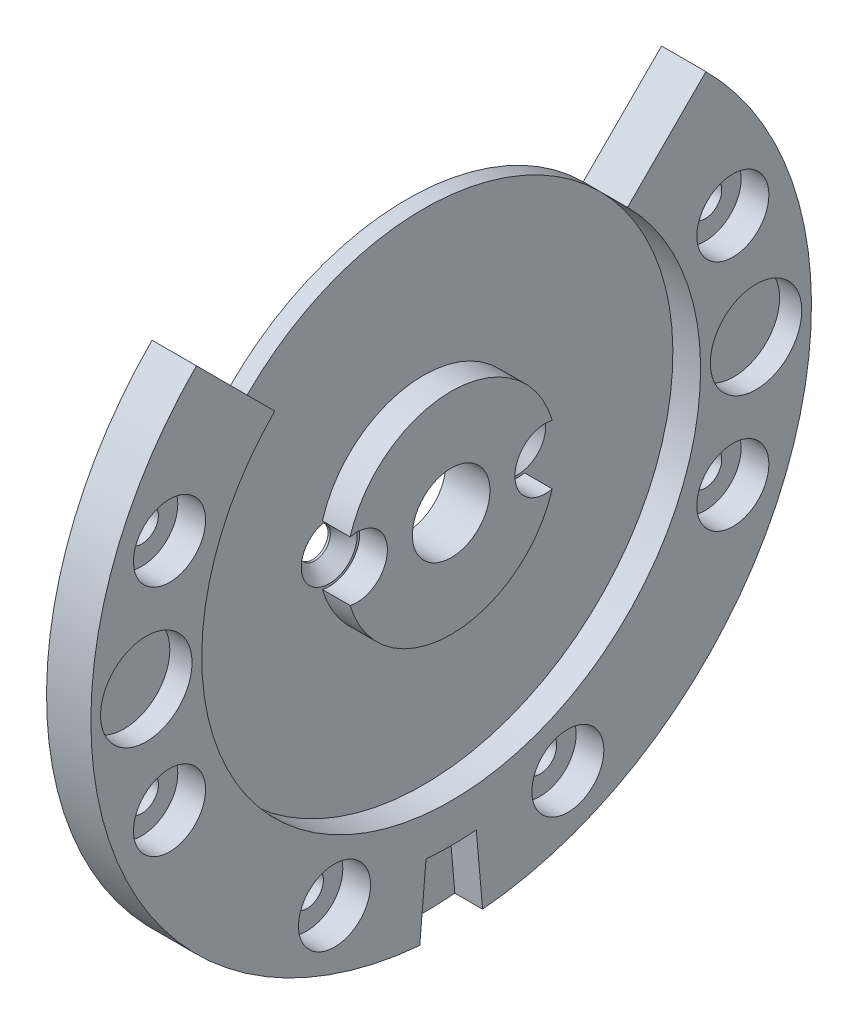
ISO-10303-21;
HEADER;
FILE_DESCRIPTION(('STEP AP214'),'2;1');
FILE_NAME('part.step','',(''),(''),'','','');
FILE_SCHEMA(('AUTOMOTIVE_DESIGN { 1 0 10303 214 1 1 1 1 }'));
ENDSEC;
DATA;
#1=APPLICATION_CONTEXT('core data for automotive mechanical design processes');
#2=APPLICATION_PROTOCOL_DEFINITION('international standard','automotive_design',2000,#1);
#3=PRODUCT_CONTEXT('',#1,'mechanical');
#4=PRODUCT('Part','Part','',(#3));
#5=PRODUCT_RELATED_PRODUCT_CATEGORY('part','',(#4));
#6=PRODUCT_DEFINITION_FORMATION('','',#4);
#7=PRODUCT_DEFINITION_CONTEXT('part definition',#1,'design');
#8=PRODUCT_DEFINITION('design','',#6,#7);
#9=PRODUCT_DEFINITION_SHAPE('','',#8);
#10=(LENGTH_UNIT() NAMED_UNIT(*) SI_UNIT(.MILLI.,.METRE.));
#11=(NAMED_UNIT(*) PLANE_ANGLE_UNIT() SI_UNIT($,.RADIAN.));
#12=(NAMED_UNIT(*) SI_UNIT($,.STERADIAN.) SOLID_ANGLE_UNIT());
#13=UNCERTAINTY_MEASURE_WITH_UNIT(LENGTH_MEASURE(1.E-05),#10,'distance_accuracy_value','');
#14=(GEOMETRIC_REPRESENTATION_CONTEXT(3) GLOBAL_UNCERTAINTY_ASSIGNED_CONTEXT((#13)) GLOBAL_UNIT_ASSIGNED_CONTEXT((#10,
#11,#12)) REPRESENTATION_CONTEXT('',''));
#15=CARTESIAN_POINT('',(0.,0.,0.));
#16=DIRECTION('',(0.,0.,1.));
#17=DIRECTION('',(1.,0.,0.));
#18=AXIS2_PLACEMENT_3D('',#15,#16,#17);
#19=CARTESIAN_POINT('',(0.,0.,0.));
#20=DIRECTION('',(-1.,0.,0.));
#21=DIRECTION('',(0.,0.,1.));
#22=AXIS2_PLACEMENT_3D('',#19,#20,#21);
#23=CYLINDRICAL_SURFACE('',#22,9.5);
#24=CARTESIAN_POINT('',(1.5,0.,0.));
#25=DIRECTION('',(-1.,0.,0.));
#26=DIRECTION('',(0.,0.,1.));
#27=AXIS2_PLACEMENT_3D('',#24,#25,#26);
#28=CIRCLE('',#27,9.5);
#29=CARTESIAN_POINT('',(1.5,2.68058577866524,9.11397058823527));
#30=VERTEX_POINT('',#29);
#31=CARTESIAN_POINT('',(1.5,2.68058577866518,-9.11397058823529));
#32=VERTEX_POINT('',#31);
#33=EDGE_CURVE('E139',#30,#32,#28,.T.);
#34=ORIENTED_EDGE('',*,*,#33,.F.);
#35=DIRECTION('',(1.,0.,0.));
#36=VECTOR('',#35,1.);
#37=CARTESIAN_POINT('',(2.75,2.68058577866524,9.11397058823527));
#38=LINE('',#37,#36);
#39=CARTESIAN_POINT('',(4.,2.68058577866524,9.11397058823527));
#40=VERTEX_POINT('',#39);
#41=EDGE_CURVE('E128',#30,#40,#38,.T.);
#42=ORIENTED_EDGE('',*,*,#41,.T.);
#43=CARTESIAN_POINT('',(4.,0.,0.));
#44=DIRECTION('',(-1.,0.,0.));
#45=DIRECTION('',(0.,0.,1.));
#46=AXIS2_PLACEMENT_3D('',#43,#44,#45);
#47=CIRCLE('',#46,9.5);
#48=CARTESIAN_POINT('',(4.,2.68058577866518,-9.11397058823529));
#49=VERTEX_POINT('',#48);
#50=EDGE_CURVE('E57',#40,#49,#47,.T.);
#51=ORIENTED_EDGE('',*,*,#50,.T.);
#52=DIRECTION('',(1.,0.,0.));
#53=VECTOR('',#52,1.);
#54=CARTESIAN_POINT('',(2.75,2.68058577866518,-9.11397058823529));
#55=LINE('',#54,#53);
#56=EDGE_CURVE('E145',#49,#32,#55,.F.);
#57=ORIENTED_EDGE('',*,*,#56,.T.);
#58=EDGE_LOOP('',(#34,#42,#51,#57));
#59=FACE_BOUND('',#58,.T.);
#60=ADVANCED_FACE('F35',(#59),#23,.T.);
#61=CARTESIAN_POINT('',(0.,10.5237943900396,-25.4066871440605));
#62=DIRECTION('',(1.,0.,0.));
#63=DIRECTION('',(0.,0.,-1.));
#64=AXIS2_PLACEMENT_3D('',#61,#62,#63);
#65=CYLINDRICAL_SURFACE('',#64,1.5);
#66=CARTESIAN_POINT('',(0.,10.5237943900396,-25.4066871440605));
#67=DIRECTION('',(1.,0.,0.));
#68=DIRECTION('',(0.,0.,-1.));
#69=AXIS2_PLACEMENT_3D('',#66,#67,#68);
#70=CIRCLE('',#69,1.5);
#71=CARTESIAN_POINT('',(0.,10.5237943900396,-26.9066871440605));
#72=VERTEX_POINT('',#71);
#73=EDGE_CURVE('E296',#72,#72,#70,.T.);
#74=ORIENTED_EDGE('',*,*,#73,.F.);
#75=EDGE_LOOP('',(#74));
#76=FACE_BOUND('',#75,.T.);
#77=CARTESIAN_POINT('',(1.5,10.5237943900396,-25.4066871440605));
#78=DIRECTION('',(1.,0.,0.));
#79=DIRECTION('',(0.,0.,-1.));
#80=AXIS2_PLACEMENT_3D('',#77,#78,#79);
#81=CIRCLE('',#80,1.5);
#82=CARTESIAN_POINT('',(1.5,10.5237943900396,-26.9066871440605));
#83=VERTEX_POINT('',#82);
#84=EDGE_CURVE('E188',#83,#83,#81,.F.);
#85=ORIENTED_EDGE('',*,*,#84,.F.);
#86=EDGE_LOOP('',(#85));
#87=FACE_BOUND('',#86,.T.);
#88=ADVANCED_FACE('F344',(#76,#87),#65,.F.);
#89=CARTESIAN_POINT('',(0.,-10.52379439004,-25.4066871440604));
#90=DIRECTION('',(1.,0.,0.));
#91=DIRECTION('',(0.,0.,-1.));
#92=AXIS2_PLACEMENT_3D('',#89,#90,#91);
#93=CYLINDRICAL_SURFACE('',#92,1.5);
#94=CARTESIAN_POINT('',(0.,-10.52379439004,-25.4066871440604));
#95=DIRECTION('',(1.,0.,0.));
#96=DIRECTION('',(0.,0.,-1.));
#97=AXIS2_PLACEMENT_3D('',#94,#95,#96);
#98=CIRCLE('',#97,1.5);
#99=CARTESIAN_POINT('',(0.,-10.52379439004,-26.9066871440604));
#100=VERTEX_POINT('',#99);
#101=EDGE_CURVE('E301',#100,#100,#98,.T.);
#102=ORIENTED_EDGE('',*,*,#101,.F.);
#103=EDGE_LOOP('',(#102));
#104=FACE_BOUND('',#103,.T.);
#105=CARTESIAN_POINT('',(1.5,-10.52379439004,-25.4066871440604));
#106=DIRECTION('',(1.,0.,0.));
#107=DIRECTION('',(0.,0.,-1.));
#108=AXIS2_PLACEMENT_3D('',#105,#106,#107);
#109=CIRCLE('',#108,1.5);
#110=CARTESIAN_POINT('',(1.5,-10.52379439004,-26.9066871440604));
#111=VERTEX_POINT('',#110);
#112=EDGE_CURVE('E184',#111,#111,#109,.F.);
#113=ORIENTED_EDGE('',*,*,#112,.F.);
#114=EDGE_LOOP('',(#113));
#115=FACE_BOUND('',#114,.T.);
#116=ADVANCED_FACE('F350',(#104,#115),#93,.F.);
#117=CARTESIAN_POINT('',(0.,-25.4066871440604,-10.5237943900399));
#118=DIRECTION('',(1.,0.,0.));
#119=DIRECTION('',(0.,0.,-1.));
#120=AXIS2_PLACEMENT_3D('',#117,#118,#119);
#121=CYLINDRICAL_SURFACE('',#120,1.5);
#122=CARTESIAN_POINT('',(0.,-25.4066871440604,-10.5237943900399));
#123=DIRECTION('',(1.,0.,0.));
#124=DIRECTION('',(0.,0.,-1.));
#125=AXIS2_PLACEMENT_3D('',#122,#123,#124);
#126=CIRCLE('',#125,1.5);
#127=CARTESIAN_POINT('',(0.,-25.4066871440604,-12.0237943900399));
#128=VERTEX_POINT('',#127);
#129=EDGE_CURVE('E304',#128,#128,#126,.T.);
#130=ORIENTED_EDGE('',*,*,#129,.F.);
#131=EDGE_LOOP('',(#130));
#132=FACE_BOUND('',#131,.T.);
#133=CARTESIAN_POINT('',(1.5,-25.4066871440604,-10.5237943900399));
#134=DIRECTION('',(1.,0.,0.));
#135=DIRECTION('',(0.,0.,-1.));
#136=AXIS2_PLACEMENT_3D('',#133,#134,#135);
#137=CIRCLE('',#136,1.5);
#138=CARTESIAN_POINT('',(1.5,-25.4066871440604,-12.0237943900399));
#139=VERTEX_POINT('',#138);
#140=EDGE_CURVE('E179',#139,#139,#137,.F.);
#141=ORIENTED_EDGE('',*,*,#140,.F.);
#142=EDGE_LOOP('',(#141));
#143=FACE_BOUND('',#142,.T.);
#144=ADVANCED_FACE('F442',(#132,#143),#121,.F.);
#145=CARTESIAN_POINT('',(0.,-25.4066871440603,10.5237943900401));
#146=DIRECTION('',(1.,0.,0.));
#147=DIRECTION('',(0.,0.,-1.));
#148=AXIS2_PLACEMENT_3D('',#145,#146,#147);
#149=CYLINDRICAL_SURFACE('',#148,1.50000000000001);
#150=CARTESIAN_POINT('',(0.,-25.4066871440603,10.5237943900401));
#151=DIRECTION('',(1.,0.,0.));
#152=DIRECTION('',(0.,0.,-1.));
#153=AXIS2_PLACEMENT_3D('',#150,#151,#152);
#154=CIRCLE('',#153,1.50000000000001);
#155=CARTESIAN_POINT('',(0.,-25.4066871440603,9.02379439004007));
#156=VERTEX_POINT('',#155);
#157=EDGE_CURVE('E307',#156,#156,#154,.T.);
#158=ORIENTED_EDGE('',*,*,#157,.F.);
#159=EDGE_LOOP('',(#158));
#160=FACE_BOUND('',#159,.T.);
#161=CARTESIAN_POINT('',(1.5,-25.4066871440603,10.5237943900401));
#162=DIRECTION('',(1.,0.,0.));
#163=DIRECTION('',(0.,0.,-1.));
#164=AXIS2_PLACEMENT_3D('',#161,#162,#163);
#165=CIRCLE('',#164,1.50000000000001);
#166=CARTESIAN_POINT('',(1.5,-25.4066871440603,9.02379439004007));
#167=VERTEX_POINT('',#166);
#168=EDGE_CURVE('E174',#167,#167,#165,.F.);
#169=ORIENTED_EDGE('',*,*,#168,.F.);
#170=EDGE_LOOP('',(#169));
#171=FACE_BOUND('',#170,.T.);
#172=ADVANCED_FACE('F446',(#160,#171),#149,.F.);
#173=CARTESIAN_POINT('',(0.,-10.5237943900398,25.4066871440604));
#174=DIRECTION('',(1.,0.,0.));
#175=DIRECTION('',(0.,0.,-1.));
#176=AXIS2_PLACEMENT_3D('',#173,#174,#175);
#177=CYLINDRICAL_SURFACE('',#176,1.5);
#178=CARTESIAN_POINT('',(0.,-10.5237943900398,25.4066871440604));
#179=DIRECTION('',(1.,0.,0.));
#180=DIRECTION('',(0.,0.,-1.));
#181=AXIS2_PLACEMENT_3D('',#178,#179,#180);
#182=CIRCLE('',#181,1.5);
#183=CARTESIAN_POINT('',(0.,-10.5237943900398,23.9066871440604));
#184=VERTEX_POINT('',#183);
#185=EDGE_CURVE('E310',#184,#184,#182,.T.);
#186=ORIENTED_EDGE('',*,*,#185,.F.);
#187=EDGE_LOOP('',(#186));
#188=FACE_BOUND('',#187,.T.);
#189=CARTESIAN_POINT('',(1.5,-10.5237943900398,25.4066871440604));
#190=DIRECTION('',(1.,0.,0.));
#191=DIRECTION('',(0.,0.,-1.));
#192=AXIS2_PLACEMENT_3D('',#189,#190,#191);
#193=CIRCLE('',#192,1.5);
#194=CARTESIAN_POINT('',(1.5,-10.5237943900398,23.9066871440604));
#195=VERTEX_POINT('',#194);
#196=EDGE_CURVE('E169',#195,#195,#193,.F.);
#197=ORIENTED_EDGE('',*,*,#196,.F.);
#198=EDGE_LOOP('',(#197));
#199=FACE_BOUND('',#198,.T.);
#200=ADVANCED_FACE('F322',(#188,#199),#177,.F.);
#201=CARTESIAN_POINT('',(0.,10.5237943900402,25.4066871440603));
#202=DIRECTION('',(1.,0.,0.));
#203=DIRECTION('',(0.,0.,-1.));
#204=AXIS2_PLACEMENT_3D('',#201,#202,#203);
#205=CYLINDRICAL_SURFACE('',#204,1.5);
#206=CARTESIAN_POINT('',(0.,10.5237943900402,25.4066871440603));
#207=DIRECTION('',(1.,0.,0.));
#208=DIRECTION('',(0.,0.,-1.));
#209=AXIS2_PLACEMENT_3D('',#206,#207,#208);
#210=CIRCLE('',#209,1.5);
#211=CARTESIAN_POINT('',(0.,10.5237943900402,23.9066871440603));
#212=VERTEX_POINT('',#211);
#213=EDGE_CURVE('E312',#212,#212,#210,.T.);
#214=ORIENTED_EDGE('',*,*,#213,.F.);
#215=EDGE_LOOP('',(#214));
#216=FACE_BOUND('',#215,.T.);
#217=CARTESIAN_POINT('',(1.5,10.5237943900402,25.4066871440603));
#218=DIRECTION('',(1.,0.,0.));
#219=DIRECTION('',(0.,0.,-1.));
#220=AXIS2_PLACEMENT_3D('',#217,#218,#219);
#221=CIRCLE('',#220,1.5);
#222=CARTESIAN_POINT('',(1.5,10.5237943900402,23.9066871440603));
#223=VERTEX_POINT('',#222);
#224=EDGE_CURVE('E164',#223,#223,#221,.F.);
#225=ORIENTED_EDGE('',*,*,#224,.F.);
#226=EDGE_LOOP('',(#225));
#227=FACE_BOUND('',#226,.T.);
#228=ADVANCED_FACE('F318',(#216,#227),#205,.F.);
#229=CARTESIAN_POINT('',(0.,0.,0.));
#230=DIRECTION('',(-1.,0.,0.));
#231=DIRECTION('',(0.,0.,1.));
#232=AXIS2_PLACEMENT_3D('',#229,#230,#231);
#233=CYLINDRICAL_SURFACE('',#232,32.5);
#234=DIRECTION('',(1.,0.,0.));
#235=VECTOR('',#234,1.);
#236=CARTESIAN_POINT('',(1.5,-32.3763276879817,-2.83256163929879));
#237=LINE('',#236,#235);
#238=CARTESIAN_POINT('',(1.5,-32.3763276879817,-2.83256163929879));
#239=VERTEX_POINT('',#238);
#240=CARTESIAN_POINT('',(4.,-32.3763276879817,-2.83256163929879));
#241=VERTEX_POINT('',#240);
#242=EDGE_CURVE('E260',#239,#241,#237,.T.);
#243=ORIENTED_EDGE('',*,*,#242,.F.);
#244=CARTESIAN_POINT('',(1.5,0.,0.));
#245=DIRECTION('',(1.,0.,0.));
#246=DIRECTION('',(0.,0.,-1.));
#247=AXIS2_PLACEMENT_3D('',#244,#245,#246);
#248=CIRCLE('',#247,32.5);
#249=CARTESIAN_POINT('',(1.5,-32.3763276879817,2.83256163929901));
#250=VERTEX_POINT('',#249);
#251=EDGE_CURVE('E244',#250,#239,#248,.T.);
#252=ORIENTED_EDGE('',*,*,#251,.F.);
#253=DIRECTION('',(1.,0.,0.));
#254=VECTOR('',#253,1.);
#255=CARTESIAN_POINT('',(1.5,-32.3763276879817,2.83256163929901));
#256=LINE('',#255,#254);
#257=CARTESIAN_POINT('',(4.,-32.3763276879817,2.83256163929901));
#258=VERTEX_POINT('',#257);
#259=EDGE_CURVE('E262',#250,#258,#256,.T.);
#260=ORIENTED_EDGE('',*,*,#259,.T.);
#261=CARTESIAN_POINT('',(4.,0.,0.));
#262=DIRECTION('',(-1.,0.,0.));
#263=DIRECTION('',(0.,0.,1.));
#264=AXIS2_PLACEMENT_3D('',#261,#262,#263);
#265=CIRCLE('',#264,32.5);
#266=CARTESIAN_POINT('',(4.,22.9809703885627,22.9809703885629));
#267=VERTEX_POINT('',#266);
#268=EDGE_CURVE('E158',#258,#267,#265,.T.);
#269=ORIENTED_EDGE('',*,*,#268,.T.);
#270=DIRECTION('',(1.,0.,0.));
#271=VECTOR('',#270,1.);
#272=CARTESIAN_POINT('',(-6.,22.9809703885627,22.9809703885629));
#273=LINE('',#272,#271);
#274=CARTESIAN_POINT('',(0.,22.9809703885627,22.9809703885629));
#275=VERTEX_POINT('',#274);
#276=EDGE_CURVE('E276',#275,#267,#273,.T.);
#277=ORIENTED_EDGE('',*,*,#276,.F.);
#278=CARTESIAN_POINT('',(0.,0.,0.));
#279=DIRECTION('',(-1.,0.,0.));
#280=DIRECTION('',(0.,0.,1.));
#281=AXIS2_PLACEMENT_3D('',#278,#279,#280);
#282=CIRCLE('',#281,32.5);
#283=CARTESIAN_POINT('',(0.,22.9809703885628,-22.9809703885628));
#284=VERTEX_POINT('',#283);
#285=EDGE_CURVE('E43',#284,#275,#282,.T.);
#286=ORIENTED_EDGE('',*,*,#285,.F.);
#287=DIRECTION('',(1.,0.,0.));
#288=VECTOR('',#287,1.);
#289=CARTESIAN_POINT('',(-6.,22.9809703885628,-22.9809703885628));
#290=LINE('',#289,#288);
#291=CARTESIAN_POINT('',(4.,22.9809703885628,-22.9809703885628));
#292=VERTEX_POINT('',#291);
#293=EDGE_CURVE('E279',#284,#292,#290,.T.);
#294=ORIENTED_EDGE('',*,*,#293,.T.);
#295=EDGE_CURVE('E159',#292,#241,#265,.T.);
#296=ORIENTED_EDGE('',*,*,#295,.T.);
#297=EDGE_LOOP('',(#243,#252,#260,#269,#277,#286,#294,#296));
#298=FACE_BOUND('',#297,.T.);
#299=ADVANCED_FACE('F321',(#298),#233,.T.);
#300=CARTESIAN_POINT('',(4.,32.5,0.));
#301=DIRECTION('',(-1.,0.,0.));
#302=DIRECTION('',(0.,0.,1.));
#303=AXIS2_PLACEMENT_3D('',#300,#301,#302);
#304=PLANE('',#303);
#305=CARTESIAN_POINT('',(4.,10.5237943900396,-25.4066871440605));
#306=DIRECTION('',(1.,0.,0.));
#307=DIRECTION('',(0.,0.,-1.));
#308=AXIS2_PLACEMENT_3D('',#305,#306,#307);
#309=CIRCLE('',#308,3.25);
#310=CARTESIAN_POINT('',(4.,10.5237943900396,-28.6566871440605));
#311=VERTEX_POINT('',#310);
#312=EDGE_CURVE('E191',#311,#311,#309,.T.);
#313=ORIENTED_EDGE('',*,*,#312,.F.);
#314=EDGE_LOOP('',(#313));
#315=FACE_BOUND('',#314,.T.);
#316=CARTESIAN_POINT('',(4.,-10.52379439004,-25.4066871440604));
#317=DIRECTION('',(1.,0.,0.));
#318=DIRECTION('',(0.,0.,-1.));
#319=AXIS2_PLACEMENT_3D('',#316,#317,#318);
#320=CIRCLE('',#319,3.25);
#321=CARTESIAN_POINT('',(4.,-10.52379439004,-28.6566871440604));
#322=VERTEX_POINT('',#321);
#323=EDGE_CURVE('E187',#322,#322,#320,.T.);
#324=ORIENTED_EDGE('',*,*,#323,.F.);
#325=EDGE_LOOP('',(#324));
#326=FACE_BOUND('',#325,.T.);
#327=CARTESIAN_POINT('',(4.,-25.4066871440604,-10.5237943900399));
#328=DIRECTION('',(1.,0.,0.));
#329=DIRECTION('',(0.,0.,-1.));
#330=AXIS2_PLACEMENT_3D('',#327,#328,#329);
#331=CIRCLE('',#330,3.25);
#332=CARTESIAN_POINT('',(4.,-25.4066871440604,-13.7737943900399));
#333=VERTEX_POINT('',#332);
#334=EDGE_CURVE('E183',#333,#333,#331,.T.);
#335=ORIENTED_EDGE('',*,*,#334,.F.);
#336=EDGE_LOOP('',(#335));
#337=FACE_BOUND('',#336,.T.);
#338=CARTESIAN_POINT('',(4.,-25.4066871440604,10.5237943900401));
#339=DIRECTION('',(1.,0.,0.));
#340=DIRECTION('',(0.,0.,-1.));
#341=AXIS2_PLACEMENT_3D('',#338,#339,#340);
#342=CIRCLE('',#341,3.25);
#343=CARTESIAN_POINT('',(4.,-25.4066871440604,7.27379439004008));
#344=VERTEX_POINT('',#343);
#345=EDGE_CURVE('E178',#344,#344,#342,.T.);
#346=ORIENTED_EDGE('',*,*,#345,.F.);
#347=EDGE_LOOP('',(#346));
#348=FACE_BOUND('',#347,.T.);
#349=CARTESIAN_POINT('',(4.,-10.5237943900398,25.4066871440604));
#350=DIRECTION('',(1.,0.,0.));
#351=DIRECTION('',(0.,0.,-1.));
#352=AXIS2_PLACEMENT_3D('',#349,#350,#351);
#353=CIRCLE('',#352,3.25);
#354=CARTESIAN_POINT('',(4.,-10.5237943900398,22.1566871440604));
#355=VERTEX_POINT('',#354);
#356=EDGE_CURVE('E173',#355,#355,#353,.T.);
#357=ORIENTED_EDGE('',*,*,#356,.F.);
#358=EDGE_LOOP('',(#357));
#359=FACE_BOUND('',#358,.T.);
#360=CARTESIAN_POINT('',(4.,10.5237943900402,25.4066871440603));
#361=DIRECTION('',(1.,0.,0.));
#362=DIRECTION('',(0.,0.,-1.));
#363=AXIS2_PLACEMENT_3D('',#360,#361,#362);
#364=CIRCLE('',#363,3.25);
#365=CARTESIAN_POINT('',(4.,10.5237943900402,22.1566871440603));
#366=VERTEX_POINT('',#365);
#367=EDGE_CURVE('E172',#366,#366,#364,.T.);
#368=ORIENTED_EDGE('',*,*,#367,.F.);
#369=EDGE_LOOP('',(#368));
#370=FACE_BOUND('',#369,.T.);
#371=CARTESIAN_POINT('',(4.,-1.92031473636372E-13,27.5));
#372=DIRECTION('',(1.,0.,0.));
#373=DIRECTION('',(0.,0.,-1.));
#374=AXIS2_PLACEMENT_3D('',#371,#372,#373);
#375=CIRCLE('',#374,4.125);
#376=CARTESIAN_POINT('',(4.,-1.92031473636372E-13,23.375));
#377=VERTEX_POINT('',#376);
#378=EDGE_CURVE('E167',#377,#377,#375,.T.);
#379=ORIENTED_EDGE('',*,*,#378,.F.);
#380=EDGE_LOOP('',(#379));
#381=FACE_BOUND('',#380,.T.);
#382=CARTESIAN_POINT('',(4.,0.,-27.5));
#383=DIRECTION('',(1.,0.,0.));
#384=DIRECTION('',(0.,0.,-1.));
#385=AXIS2_PLACEMENT_3D('',#382,#383,#384);
#386=CIRCLE('',#385,4.125);
#387=CARTESIAN_POINT('',(4.,0.,-31.625));
#388=VERTEX_POINT('',#387);
#389=EDGE_CURVE('E228',#388,#388,#386,.T.);
#390=ORIENTED_EDGE('',*,*,#389,.F.);
#391=EDGE_LOOP('',(#390));
#392=FACE_BOUND('',#391,.T.);
#393=DIRECTION('',(0.,-0.996194698091746,-0.0871557427476551));
#394=VECTOR('',#393,1.);
#395=CARTESIAN_POINT('',(4.,0.,0.));
#396=LINE('',#395,#394);
#397=CARTESIAN_POINT('',(4.,-25.9010621503854,-2.26604931143903));
#398=VERTEX_POINT('',#397);
#399=EDGE_CURVE('E241',#398,#241,#396,.T.);
#400=ORIENTED_EDGE('',*,*,#399,.T.);
#401=ORIENTED_EDGE('',*,*,#295,.F.);
#402=DIRECTION('',(0.,0.707106781186549,-0.707106781186546));
#403=VECTOR('',#402,1.);
#404=CARTESIAN_POINT('',(4.,0.,0.));
#405=LINE('',#404,#403);
#406=CARTESIAN_POINT('',(4.,15.9099025766974,-15.9099025766973));
#407=VERTEX_POINT('',#406);
#408=EDGE_CURVE('E259',#407,#292,#405,.T.);
#409=ORIENTED_EDGE('',*,*,#408,.F.);
#410=CARTESIAN_POINT('',(4.,0.,0.));
#411=DIRECTION('',(-1.,0.,0.));
#412=DIRECTION('',(0.,0.,1.));
#413=AXIS2_PLACEMENT_3D('',#410,#411,#412);
#414=CIRCLE('',#413,22.5);
#415=CARTESIAN_POINT('',(4.,15.9099025766972,15.9099025766974));
#416=VERTEX_POINT('',#415);
#417=EDGE_CURVE('E155',#407,#416,#414,.T.);
#418=ORIENTED_EDGE('',*,*,#417,.T.);
#419=DIRECTION('',(0.,0.707106781186544,0.707106781186551));
#420=VECTOR('',#419,1.);
#421=CARTESIAN_POINT('',(4.,0.,0.));
#422=LINE('',#421,#420);
#423=EDGE_CURVE('E268',#416,#267,#422,.T.);
#424=ORIENTED_EDGE('',*,*,#423,.T.);
#425=ORIENTED_EDGE('',*,*,#268,.F.);
#426=DIRECTION('',(0.,-0.996194698091745,0.087155742747662));
#427=VECTOR('',#426,1.);
#428=CARTESIAN_POINT('',(4.,0.,0.));
#429=LINE('',#428,#427);
#430=CARTESIAN_POINT('',(4.,-25.9010621503854,2.26604931143921));
#431=VERTEX_POINT('',#430);
#432=EDGE_CURVE('E252',#431,#258,#429,.T.);
#433=ORIENTED_EDGE('',*,*,#432,.F.);
#434=CARTESIAN_POINT('',(4.,0.,0.));
#435=DIRECTION('',(1.,0.,0.));
#436=DIRECTION('',(0.,0.,-1.));
#437=AXIS2_PLACEMENT_3D('',#434,#435,#436);
#438=CIRCLE('',#437,26.);
#439=EDGE_CURVE('E234',#431,#398,#438,.T.);
#440=ORIENTED_EDGE('',*,*,#439,.T.);
#441=EDGE_LOOP('',(#400,#401,#409,#418,#424,#425,#433,#440));
#442=FACE_BOUND('',#441,.T.);
#443=ADVANCED_FACE('F414',(#315,#326,#337,#348,#359,#370,#381,#392,#442),#304,.F.);
#444=CARTESIAN_POINT('',(0.,0.,0.));
#445=DIRECTION('',(1.,0.,0.));
#446=DIRECTION('',(0.,0.,-1.));
#447=AXIS2_PLACEMENT_3D('',#444,#445,#446);
#448=PLANE('',#447);
#449=CARTESIAN_POINT('',(0.,0.,8.5));
#450=DIRECTION('',(1.,0.,0.));
#451=DIRECTION('',(0.,0.,-1.));
#452=AXIS2_PLACEMENT_3D('',#449,#450,#451);
#453=CIRCLE('',#452,1.397);
#454=CARTESIAN_POINT('',(0.,0.,7.103));
#455=VERTEX_POINT('',#454);
#456=EDGE_CURVE('E384',#455,#455,#453,.T.);
#457=ORIENTED_EDGE('',*,*,#456,.T.);
#458=EDGE_LOOP('',(#457));
#459=FACE_BOUND('',#458,.T.);
#460=CARTESIAN_POINT('',(0.,0.,-8.5));
#461=DIRECTION('',(1.,0.,0.));
#462=DIRECTION('',(0.,0.,-1.));
#463=AXIS2_PLACEMENT_3D('',#460,#461,#462);
#464=CIRCLE('',#463,1.397);
#465=CARTESIAN_POINT('',(0.,0.,-9.897));
#466=VERTEX_POINT('',#465);
#467=EDGE_CURVE('E143',#466,#466,#464,.T.);
#468=ORIENTED_EDGE('',*,*,#467,.T.);
#469=EDGE_LOOP('',(#468));
#470=FACE_BOUND('',#469,.T.);
#471=ORIENTED_EDGE('',*,*,#213,.T.);
#472=EDGE_LOOP('',(#471));
#473=FACE_BOUND('',#472,.T.);
#474=ORIENTED_EDGE('',*,*,#185,.T.);
#475=EDGE_LOOP('',(#474));
#476=FACE_BOUND('',#475,.T.);
#477=ORIENTED_EDGE('',*,*,#157,.T.);
#478=EDGE_LOOP('',(#477));
#479=FACE_BOUND('',#478,.T.);
#480=ORIENTED_EDGE('',*,*,#129,.T.);
#481=EDGE_LOOP('',(#480));
#482=FACE_BOUND('',#481,.T.);
#483=ORIENTED_EDGE('',*,*,#101,.T.);
#484=EDGE_LOOP('',(#483));
#485=FACE_BOUND('',#484,.T.);
#486=ORIENTED_EDGE('',*,*,#73,.T.);
#487=EDGE_LOOP('',(#486));
#488=FACE_BOUND('',#487,.T.);
#489=CARTESIAN_POINT('',(0.,0.,0.));
#490=DIRECTION('',(1.,0.,0.));
#491=DIRECTION('',(0.,0.,-1.));
#492=AXIS2_PLACEMENT_3D('',#489,#490,#491);
#493=CIRCLE('',#492,3.5);
#494=CARTESIAN_POINT('',(0.,0.,-3.5));
#495=VERTEX_POINT('',#494);
#496=EDGE_CURVE('E292',#495,#495,#493,.T.);
#497=ORIENTED_EDGE('',*,*,#496,.T.);
#498=EDGE_LOOP('',(#497));
#499=FACE_BOUND('',#498,.T.);
#500=DIRECTION('',(0.,0.707106781186544,0.707106781186551));
#501=VECTOR('',#500,1.);
#502=CARTESIAN_POINT('',(0.,0.,0.));
#503=LINE('',#502,#501);
#504=CARTESIAN_POINT('',(0.,15.9099025766972,15.9099025766974));
#505=VERTEX_POINT('',#504);
#506=EDGE_CURVE('E287',#505,#275,#503,.T.);
#507=ORIENTED_EDGE('',*,*,#506,.F.);
#508=CARTESIAN_POINT('',(0.,0.,0.));
#509=DIRECTION('',(1.,0.,0.));
#510=DIRECTION('',(0.,0.,-1.));
#511=AXIS2_PLACEMENT_3D('',#508,#509,#510);
#512=CIRCLE('',#511,22.5);
#513=CARTESIAN_POINT('',(0.,15.9099025766974,-15.9099025766973));
#514=VERTEX_POINT('',#513);
#515=EDGE_CURVE('E289',#505,#514,#512,.F.);
#516=ORIENTED_EDGE('',*,*,#515,.T.);
#517=DIRECTION('',(0.,0.707106781186549,-0.707106781186546));
#518=VECTOR('',#517,1.);
#519=CARTESIAN_POINT('',(0.,0.,0.));
#520=LINE('',#519,#518);
#521=EDGE_CURVE('E284',#514,#284,#520,.T.);
#522=ORIENTED_EDGE('',*,*,#521,.T.);
#523=ORIENTED_EDGE('',*,*,#285,.T.);
#524=EDGE_LOOP('',(#507,#516,#522,#523));
#525=FACE_BOUND('',#524,.T.);
#526=ADVANCED_FACE('F37',(#459,#470,#473,#476,#479,#482,#485,#488,#499,#525),#448,.F.);
#527=CARTESIAN_POINT('',(0.,0.,0.));
#528=DIRECTION('',(-1.,0.,0.));
#529=DIRECTION('',(0.,0.,1.));
#530=AXIS2_PLACEMENT_3D('',#527,#528,#529);
#531=CYLINDRICAL_SURFACE('',#530,22.5);
#532=DIRECTION('',(1.,0.,0.));
#533=VECTOR('',#532,1.);
#534=CARTESIAN_POINT('',(-6.,15.9099025766972,15.9099025766974));
#535=LINE('',#534,#533);
#536=CARTESIAN_POINT('',(1.5,15.9099025766972,15.9099025766974));
#537=VERTEX_POINT('',#536);
#538=EDGE_CURVE('E272',#537,#416,#535,.T.);
#539=ORIENTED_EDGE('',*,*,#538,.T.);
#540=ORIENTED_EDGE('',*,*,#417,.F.);
#541=DIRECTION('',(1.,0.,0.));
#542=VECTOR('',#541,1.);
#543=CARTESIAN_POINT('',(-6.,15.9099025766974,-15.9099025766973));
#544=LINE('',#543,#542);
#545=CARTESIAN_POINT('',(1.5,15.9099025766974,-15.9099025766973));
#546=VERTEX_POINT('',#545);
#547=EDGE_CURVE('E271',#546,#407,#544,.T.);
#548=ORIENTED_EDGE('',*,*,#547,.F.);
#549=CARTESIAN_POINT('',(1.5,0.,0.));
#550=DIRECTION('',(-1.,0.,0.));
#551=DIRECTION('',(0.,0.,1.));
#552=AXIS2_PLACEMENT_3D('',#549,#550,#551);
#553=CIRCLE('',#552,22.5);
#554=EDGE_CURVE('E148',#546,#537,#553,.T.);
#555=ORIENTED_EDGE('',*,*,#554,.T.);
#556=EDGE_LOOP('',(#539,#540,#548,#555));
#557=FACE_BOUND('',#556,.T.);
#558=ADVANCED_FACE('F364',(#557),#531,.F.);
#559=CARTESIAN_POINT('',(1.5,22.5,0.));
#560=DIRECTION('',(-1.,0.,0.));
#561=DIRECTION('',(0.,0.,1.));
#562=AXIS2_PLACEMENT_3D('',#559,#560,#561);
#563=PLANE('',#562);
#564=CARTESIAN_POINT('',(1.5,0.,8.5));
#565=DIRECTION('',(1.,0.,0.));
#566=DIRECTION('',(0.,0.,-1.));
#567=AXIS2_PLACEMENT_3D('',#564,#565,#566);
#568=CIRCLE('',#567,2.5273);
#569=CARTESIAN_POINT('',(1.5,0.,5.9727));
#570=VERTEX_POINT('',#569);
#571=EDGE_CURVE('E390',#570,#570,#568,.T.);
#572=ORIENTED_EDGE('',*,*,#571,.F.);
#573=EDGE_LOOP('',(#572));
#574=FACE_BOUND('',#573,.T.);
#575=CARTESIAN_POINT('',(1.5,0.,-8.5));
#576=DIRECTION('',(1.,0.,0.));
#577=DIRECTION('',(0.,0.,-1.));
#578=AXIS2_PLACEMENT_3D('',#575,#576,#577);
#579=CIRCLE('',#578,2.5273);
#580=CARTESIAN_POINT('',(1.5,0.,-11.0273));
#581=VERTEX_POINT('',#580);
#582=EDGE_CURVE('E381',#581,#581,#579,.T.);
#583=ORIENTED_EDGE('',*,*,#582,.F.);
#584=EDGE_LOOP('',(#583));
#585=FACE_BOUND('',#584,.T.);
#586=EDGE_CURVE('E153',#537,#546,#553,.T.);
#587=ORIENTED_EDGE('',*,*,#586,.F.);
#588=ORIENTED_EDGE('',*,*,#554,.F.);
#589=EDGE_LOOP('',(#587,#588));
#590=FACE_BOUND('',#589,.T.);
#591=CARTESIAN_POINT('',(1.5,-2.68058577866518,-9.11397058823529));
#592=VERTEX_POINT('',#591);
#593=CARTESIAN_POINT('',(1.5,-2.68058577866512,9.11397058823531));
#594=VERTEX_POINT('',#593);
#595=EDGE_CURVE('E142',#592,#594,#28,.T.);
#596=ORIENTED_EDGE('',*,*,#595,.T.);
#597=CARTESIAN_POINT('',(1.5,0.,8.5));
#598=DIRECTION('',(1.,0.,0.));
#599=DIRECTION('',(0.,0.,-1.));
#600=AXIS2_PLACEMENT_3D('',#597,#598,#599);
#601=CIRCLE('',#600,2.75);
#602=EDGE_CURVE('E131',#594,#30,#601,.T.);
#603=ORIENTED_EDGE('',*,*,#602,.T.);
#604=ORIENTED_EDGE('',*,*,#33,.T.);
#605=CARTESIAN_POINT('',(1.5,0.,-8.5));
#606=DIRECTION('',(1.,0.,0.));
#607=DIRECTION('',(0.,0.,-1.));
#608=AXIS2_PLACEMENT_3D('',#605,#606,#607);
#609=CIRCLE('',#608,2.75);
#610=EDGE_CURVE('E133',#32,#592,#609,.T.);
#611=ORIENTED_EDGE('',*,*,#610,.T.);
#612=EDGE_LOOP('',(#596,#603,#604,#611));
#613=FACE_BOUND('',#612,.T.);
#614=ADVANCED_FACE('F137',(#574,#585,#590,#613),#563,.F.);
#615=CARTESIAN_POINT('',(4.,-2.68058577866518,-9.11397058823529));
#616=VERTEX_POINT('',#615);
#617=CARTESIAN_POINT('',(4.,-2.68058577866512,9.11397058823531));
#618=VERTEX_POINT('',#617);
#619=EDGE_CURVE('E146',#616,#618,#47,.T.);
#620=ORIENTED_EDGE('',*,*,#619,.T.);
#621=DIRECTION('',(1.,0.,0.));
#622=VECTOR('',#621,1.);
#623=CARTESIAN_POINT('',(2.75,-2.68058577866512,9.11397058823531));
#624=LINE('',#623,#622);
#625=EDGE_CURVE('E50',#618,#594,#624,.F.);
#626=ORIENTED_EDGE('',*,*,#625,.T.);
#627=ORIENTED_EDGE('',*,*,#595,.F.);
#628=DIRECTION('',(1.,0.,0.));
#629=VECTOR('',#628,1.);
#630=CARTESIAN_POINT('',(2.75,-2.68058577866518,-9.11397058823529));
#631=LINE('',#630,#629);
#632=EDGE_CURVE('E202',#592,#616,#631,.T.);
#633=ORIENTED_EDGE('',*,*,#632,.T.);
#634=EDGE_LOOP('',(#620,#626,#627,#633));
#635=FACE_BOUND('',#634,.T.);
#636=ADVANCED_FACE('F346',(#635),#23,.T.);
#637=CARTESIAN_POINT('',(4.,9.5,0.));
#638=DIRECTION('',(-1.,0.,0.));
#639=DIRECTION('',(0.,0.,1.));
#640=AXIS2_PLACEMENT_3D('',#637,#638,#639);
#641=PLANE('',#640);
#642=CARTESIAN_POINT('',(4.,0.,0.));
#643=DIRECTION('',(1.,0.,0.));
#644=DIRECTION('',(0.,0.,-1.));
#645=AXIS2_PLACEMENT_3D('',#642,#643,#644);
#646=CIRCLE('',#645,3.5);
#647=CARTESIAN_POINT('',(4.,0.,-3.5));
#648=VERTEX_POINT('',#647);
#649=EDGE_CURVE('E293',#648,#648,#646,.T.);
#650=ORIENTED_EDGE('',*,*,#649,.F.);
#651=EDGE_LOOP('',(#650));
#652=FACE_BOUND('',#651,.T.);
#653=ORIENTED_EDGE('',*,*,#50,.F.);
#654=CARTESIAN_POINT('',(4.,0.,8.5));
#655=DIRECTION('',(-1.,0.,0.));
#656=DIRECTION('',(0.,0.,1.));
#657=AXIS2_PLACEMENT_3D('',#654,#655,#656);
#658=CIRCLE('',#657,2.75);
#659=EDGE_CURVE('E11',#40,#618,#658,.T.);
#660=ORIENTED_EDGE('',*,*,#659,.T.);
#661=ORIENTED_EDGE('',*,*,#619,.F.);
#662=CARTESIAN_POINT('',(4.,0.,-8.5));
#663=DIRECTION('',(1.,0.,0.));
#664=DIRECTION('',(0.,0.,-1.));
#665=AXIS2_PLACEMENT_3D('',#662,#663,#664);
#666=CIRCLE('',#665,2.75);
#667=EDGE_CURVE('E370',#49,#616,#666,.T.);
#668=ORIENTED_EDGE('',*,*,#667,.F.);
#669=EDGE_LOOP('',(#653,#660,#661,#668));
#670=FACE_BOUND('',#669,.T.);
#671=ADVANCED_FACE('F356',(#652,#670),#641,.F.);
#672=CARTESIAN_POINT('',(0.,0.,0.));
#673=DIRECTION('',(1.,0.,0.));
#674=DIRECTION('',(0.,0.,-1.));
#675=AXIS2_PLACEMENT_3D('',#672,#673,#674);
#676=CYLINDRICAL_SURFACE('',#675,3.5);
#677=ORIENTED_EDGE('',*,*,#496,.F.);
#678=EDGE_LOOP('',(#677));
#679=FACE_BOUND('',#678,.T.);
#680=ORIENTED_EDGE('',*,*,#649,.T.);
#681=EDGE_LOOP('',(#680));
#682=FACE_BOUND('',#681,.T.);
#683=ADVANCED_FACE('F362',(#679,#682),#676,.F.);
#684=CARTESIAN_POINT('',(-6.,0.,0.));
#685=DIRECTION('',(1.,0.,0.));
#686=DIRECTION('',(0.,0.,-1.));
#687=AXIS2_PLACEMENT_3D('',#684,#685,#686);
#688=CYLINDRICAL_SURFACE('',#687,22.5);
#689=EDGE_CURVE('E275',#505,#537,#535,.T.);
#690=ORIENTED_EDGE('',*,*,#689,.T.);
#691=ORIENTED_EDGE('',*,*,#586,.T.);
#692=EDGE_CURVE('E282',#514,#546,#544,.T.);
#693=ORIENTED_EDGE('',*,*,#692,.F.);
#694=ORIENTED_EDGE('',*,*,#515,.F.);
#695=EDGE_LOOP('',(#690,#691,#693,#694));
#696=FACE_BOUND('',#695,.T.);
#697=ADVANCED_FACE('F404',(#696),#688,.T.);
#698=CARTESIAN_POINT('',(-6.,0.,0.));
#699=DIRECTION('',(0.,0.707106781186551,-0.707106781186544));
#700=DIRECTION('',(0.,0.707106781186544,0.707106781186551));
#701=AXIS2_PLACEMENT_3D('',#698,#699,#700);
#702=PLANE('',#701);
#703=ORIENTED_EDGE('',*,*,#506,.T.);
#704=ORIENTED_EDGE('',*,*,#276,.T.);
#705=ORIENTED_EDGE('',*,*,#423,.F.);
#706=ORIENTED_EDGE('',*,*,#538,.F.);
#707=ORIENTED_EDGE('',*,*,#689,.F.);
#708=EDGE_LOOP('',(#703,#704,#705,#706,#707));
#709=FACE_BOUND('',#708,.T.);
#710=ADVANCED_FACE('F424',(#709),#702,.T.);
#711=CARTESIAN_POINT('',(-6.,0.,0.));
#712=DIRECTION('',(0.,-0.707106781186546,-0.707106781186549));
#713=DIRECTION('',(0.,0.707106781186549,-0.707106781186546));
#714=AXIS2_PLACEMENT_3D('',#711,#712,#713);
#715=PLANE('',#714);
#716=ORIENTED_EDGE('',*,*,#692,.T.);
#717=ORIENTED_EDGE('',*,*,#547,.T.);
#718=ORIENTED_EDGE('',*,*,#408,.T.);
#719=ORIENTED_EDGE('',*,*,#293,.F.);
#720=ORIENTED_EDGE('',*,*,#521,.F.);
#721=EDGE_LOOP('',(#716,#717,#718,#719,#720));
#722=FACE_BOUND('',#721,.T.);
#723=ADVANCED_FACE('F409',(#722),#715,.F.);
#724=CARTESIAN_POINT('',(1.5,0.,0.));
#725=DIRECTION('',(1.,0.,0.));
#726=DIRECTION('',(0.,0.,-1.));
#727=AXIS2_PLACEMENT_3D('',#724,#725,#726);
#728=CYLINDRICAL_SURFACE('',#727,26.);
#729=ORIENTED_EDGE('',*,*,#439,.F.);
#730=DIRECTION('',(1.,0.,0.));
#731=VECTOR('',#730,1.);
#732=CARTESIAN_POINT('',(1.5,-25.9010621503854,2.26604931143921));
#733=LINE('',#732,#731);
#734=CARTESIAN_POINT('',(1.5,-25.9010621503854,2.26604931143921));
#735=VERTEX_POINT('',#734);
#736=EDGE_CURVE('E249',#735,#431,#733,.T.);
#737=ORIENTED_EDGE('',*,*,#736,.F.);
#738=CARTESIAN_POINT('',(1.5,0.,0.));
#739=DIRECTION('',(1.,0.,0.));
#740=DIRECTION('',(0.,0.,-1.));
#741=AXIS2_PLACEMENT_3D('',#738,#739,#740);
#742=CIRCLE('',#741,26.);
#743=CARTESIAN_POINT('',(1.5,-25.9010621503854,-2.26604931143903));
#744=VERTEX_POINT('',#743);
#745=EDGE_CURVE('E237',#735,#744,#742,.T.);
#746=ORIENTED_EDGE('',*,*,#745,.T.);
#747=DIRECTION('',(1.,0.,0.));
#748=VECTOR('',#747,1.);
#749=CARTESIAN_POINT('',(1.5,-25.9010621503854,-2.26604931143903));
#750=LINE('',#749,#748);
#751=EDGE_CURVE('E256',#744,#398,#750,.T.);
#752=ORIENTED_EDGE('',*,*,#751,.T.);
#753=EDGE_LOOP('',(#729,#737,#746,#752));
#754=FACE_BOUND('',#753,.T.);
#755=ADVANCED_FACE('F431',(#754),#728,.T.);
#756=CARTESIAN_POINT('',(1.5,0.,0.));
#757=DIRECTION('',(0.,-0.087155742747655,0.996194698091746));
#758=DIRECTION('',(0.,-0.996194698091746,-0.0871557427476551));
#759=AXIS2_PLACEMENT_3D('',#756,#757,#758);
#760=PLANE('',#759);
#761=ORIENTED_EDGE('',*,*,#399,.F.);
#762=ORIENTED_EDGE('',*,*,#751,.F.);
#763=DIRECTION('',(0.,-0.996194698091746,-0.0871557427476551));
#764=VECTOR('',#763,1.);
#765=CARTESIAN_POINT('',(1.5,0.,0.));
#766=LINE('',#765,#764);
#767=EDGE_CURVE('E247',#744,#239,#766,.T.);
#768=ORIENTED_EDGE('',*,*,#767,.T.);
#769=ORIENTED_EDGE('',*,*,#242,.T.);
#770=EDGE_LOOP('',(#761,#762,#768,#769));
#771=FACE_BOUND('',#770,.T.);
#772=ADVANCED_FACE('F716',(#771),#760,.T.);
#773=CARTESIAN_POINT('',(1.5,0.,0.));
#774=DIRECTION('',(0.,0.087155742747662,0.996194698091745));
#775=DIRECTION('',(0.,-0.996194698091745,0.087155742747662));
#776=AXIS2_PLACEMENT_3D('',#773,#774,#775);
#777=PLANE('',#776);
#778=ORIENTED_EDGE('',*,*,#432,.T.);
#779=ORIENTED_EDGE('',*,*,#259,.F.);
#780=DIRECTION('',(0.,-0.996194698091745,0.087155742747662));
#781=VECTOR('',#780,1.);
#782=CARTESIAN_POINT('',(1.5,0.,0.));
#783=LINE('',#782,#781);
#784=EDGE_CURVE('E240',#735,#250,#783,.T.);
#785=ORIENTED_EDGE('',*,*,#784,.F.);
#786=ORIENTED_EDGE('',*,*,#736,.T.);
#787=EDGE_LOOP('',(#778,#779,#785,#786));
#788=FACE_BOUND('',#787,.T.);
#789=ADVANCED_FACE('F706',(#788),#777,.F.);
#790=CARTESIAN_POINT('',(1.5,0.,0.));
#791=DIRECTION('',(1.,0.,0.));
#792=DIRECTION('',(0.,0.,-1.));
#793=AXIS2_PLACEMENT_3D('',#790,#791,#792);
#794=PLANE('',#793);
#795=ORIENTED_EDGE('',*,*,#745,.F.);
#796=ORIENTED_EDGE('',*,*,#784,.T.);
#797=ORIENTED_EDGE('',*,*,#251,.T.);
#798=ORIENTED_EDGE('',*,*,#767,.F.);
#799=EDGE_LOOP('',(#795,#796,#797,#798));
#800=FACE_BOUND('',#799,.T.);
#801=ADVANCED_FACE('F696',(#800),#794,.T.);
#802=CARTESIAN_POINT('',(2.,0.,-27.5));
#803=DIRECTION('',(1.,0.,0.));
#804=DIRECTION('',(0.,0.,-1.));
#805=AXIS2_PLACEMENT_3D('',#802,#803,#804);
#806=CYLINDRICAL_SURFACE('',#805,4.125);
#807=CARTESIAN_POINT('',(2.,0.,-27.5));
#808=DIRECTION('',(1.,0.,0.));
#809=DIRECTION('',(0.,0.,-1.));
#810=AXIS2_PLACEMENT_3D('',#807,#808,#809);
#811=CIRCLE('',#810,4.125);
#812=CARTESIAN_POINT('',(2.,0.,-31.625));
#813=VERTEX_POINT('',#812);
#814=EDGE_CURVE('E231',#813,#813,#811,.T.);
#815=ORIENTED_EDGE('',*,*,#814,.F.);
#816=EDGE_LOOP('',(#815));
#817=FACE_BOUND('',#816,.T.);
#818=ORIENTED_EDGE('',*,*,#389,.T.);
#819=EDGE_LOOP('',(#818));
#820=FACE_BOUND('',#819,.T.);
#821=ADVANCED_FACE('F685',(#817,#820),#806,.F.);
#822=CARTESIAN_POINT('',(2.,0.,0.));
#823=DIRECTION('',(1.,0.,0.));
#824=DIRECTION('',(0.,0.,-1.));
#825=AXIS2_PLACEMENT_3D('',#822,#823,#824);
#826=PLANE('',#825);
#827=ORIENTED_EDGE('',*,*,#814,.T.);
#828=EDGE_LOOP('',(#827));
#829=FACE_BOUND('',#828,.T.);
#830=ADVANCED_FACE('F675',(#829),#826,.T.);
#831=CARTESIAN_POINT('',(2.,-1.92031473636372E-13,27.5));
#832=DIRECTION('',(1.,0.,0.));
#833=DIRECTION('',(0.,0.,-1.));
#834=AXIS2_PLACEMENT_3D('',#831,#832,#833);
#835=CYLINDRICAL_SURFACE('',#834,4.125);
#836=CARTESIAN_POINT('',(2.,-1.92031473636372E-13,27.5));
#837=DIRECTION('',(1.,0.,0.));
#838=DIRECTION('',(0.,0.,-1.));
#839=AXIS2_PLACEMENT_3D('',#836,#837,#838);
#840=CIRCLE('',#839,4.125);
#841=CARTESIAN_POINT('',(2.,-1.92031473636372E-13,23.375));
#842=VERTEX_POINT('',#841);
#843=EDGE_CURVE('E225',#842,#842,#840,.T.);
#844=ORIENTED_EDGE('',*,*,#843,.F.);
#845=EDGE_LOOP('',(#844));
#846=FACE_BOUND('',#845,.T.);
#847=ORIENTED_EDGE('',*,*,#378,.T.);
#848=EDGE_LOOP('',(#847));
#849=FACE_BOUND('',#848,.T.);
#850=ADVANCED_FACE('F339',(#846,#849),#835,.F.);
#851=CARTESIAN_POINT('',(2.,0.,0.));
#852=DIRECTION('',(1.,0.,0.));
#853=DIRECTION('',(0.,0.,-1.));
#854=AXIS2_PLACEMENT_3D('',#851,#852,#853);
#855=PLANE('',#854);
#856=ORIENTED_EDGE('',*,*,#843,.T.);
#857=EDGE_LOOP('',(#856));
#858=FACE_BOUND('',#857,.T.);
#859=ADVANCED_FACE('F329',(#858),#855,.T.);
#860=CARTESIAN_POINT('',(1.5,10.5237943900402,25.4066871440603));
#861=DIRECTION('',(1.,0.,0.));
#862=DIRECTION('',(0.,0.,-1.));
#863=AXIS2_PLACEMENT_3D('',#860,#861,#862);
#864=PLANE('',#863);
#865=CARTESIAN_POINT('',(1.5,10.5237943900402,25.4066871440603));
#866=DIRECTION('',(1.,0.,0.));
#867=DIRECTION('',(0.,0.,-1.));
#868=AXIS2_PLACEMENT_3D('',#865,#866,#867);
#869=CIRCLE('',#868,3.25);
#870=CARTESIAN_POINT('',(1.5,10.5237943900402,22.1566871440603));
#871=VERTEX_POINT('',#870);
#872=EDGE_CURVE('E168',#871,#871,#869,.T.);
#873=ORIENTED_EDGE('',*,*,#872,.T.);
#874=EDGE_LOOP('',(#873));
#875=FACE_BOUND('',#874,.T.);
#876=ORIENTED_EDGE('',*,*,#224,.T.);
#877=EDGE_LOOP('',(#876));
#878=FACE_BOUND('',#877,.T.);
#879=ADVANCED_FACE('F326',(#875,#878),#864,.T.);
#880=CARTESIAN_POINT('',(1.5,10.5237943900402,25.4066871440603));
#881=DIRECTION('',(1.,0.,0.));
#882=DIRECTION('',(0.,0.,-1.));
#883=AXIS2_PLACEMENT_3D('',#880,#881,#882);
#884=CYLINDRICAL_SURFACE('',#883,3.25);
#885=ORIENTED_EDGE('',*,*,#872,.F.);
#886=EDGE_LOOP('',(#885));
#887=FACE_BOUND('',#886,.T.);
#888=ORIENTED_EDGE('',*,*,#367,.T.);
#889=EDGE_LOOP('',(#888));
#890=FACE_BOUND('',#889,.T.);
#891=ADVANCED_FACE('F328',(#887,#890),#884,.F.);
#892=CARTESIAN_POINT('',(1.5,-10.5237943900398,25.4066871440604));
#893=DIRECTION('',(1.,0.,0.));
#894=DIRECTION('',(0.,0.,-1.));
#895=AXIS2_PLACEMENT_3D('',#892,#893,#894);
#896=PLANE('',#895);
#897=CARTESIAN_POINT('',(1.5,-10.5237943900398,25.4066871440604));
#898=DIRECTION('',(1.,0.,0.));
#899=DIRECTION('',(0.,0.,-1.));
#900=AXIS2_PLACEMENT_3D('',#897,#898,#899);
#901=CIRCLE('',#900,3.25);
#902=CARTESIAN_POINT('',(1.5,-10.5237943900398,22.1566871440604));
#903=VERTEX_POINT('',#902);
#904=EDGE_CURVE('E177',#903,#903,#901,.T.);
#905=ORIENTED_EDGE('',*,*,#904,.T.);
#906=EDGE_LOOP('',(#905));
#907=FACE_BOUND('',#906,.T.);
#908=ORIENTED_EDGE('',*,*,#196,.T.);
#909=EDGE_LOOP('',(#908));
#910=FACE_BOUND('',#909,.T.);
#911=ADVANCED_FACE('F336',(#907,#910),#896,.T.);
#912=CARTESIAN_POINT('',(1.5,-10.5237943900398,25.4066871440604));
#913=DIRECTION('',(1.,0.,0.));
#914=DIRECTION('',(0.,0.,-1.));
#915=AXIS2_PLACEMENT_3D('',#912,#913,#914);
#916=CYLINDRICAL_SURFACE('',#915,3.25);
#917=ORIENTED_EDGE('',*,*,#904,.F.);
#918=EDGE_LOOP('',(#917));
#919=FACE_BOUND('',#918,.T.);
#920=ORIENTED_EDGE('',*,*,#356,.T.);
#921=EDGE_LOOP('',(#920));
#922=FACE_BOUND('',#921,.T.);
#923=ADVANCED_FACE('F460',(#919,#922),#916,.F.);
#924=CARTESIAN_POINT('',(1.5,-25.4066871440604,10.5237943900401));
#925=DIRECTION('',(1.,0.,0.));
#926=DIRECTION('',(0.,0.,-1.));
#927=AXIS2_PLACEMENT_3D('',#924,#925,#926);
#928=PLANE('',#927);
#929=CARTESIAN_POINT('',(1.5,-25.4066871440604,10.5237943900401));
#930=DIRECTION('',(1.,0.,0.));
#931=DIRECTION('',(0.,0.,-1.));
#932=AXIS2_PLACEMENT_3D('',#929,#930,#931);
#933=CIRCLE('',#932,3.25);
#934=CARTESIAN_POINT('',(1.5,-25.4066871440604,7.27379439004008));
#935=VERTEX_POINT('',#934);
#936=EDGE_CURVE('E182',#935,#935,#933,.T.);
#937=ORIENTED_EDGE('',*,*,#936,.T.);
#938=EDGE_LOOP('',(#937));
#939=FACE_BOUND('',#938,.T.);
#940=ORIENTED_EDGE('',*,*,#168,.T.);
#941=EDGE_LOOP('',(#940));
#942=FACE_BOUND('',#941,.T.);
#943=ADVANCED_FACE('F465',(#939,#942),#928,.T.);
#944=CARTESIAN_POINT('',(1.5,-25.4066871440604,10.5237943900401));
#945=DIRECTION('',(1.,0.,0.));
#946=DIRECTION('',(0.,0.,-1.));
#947=AXIS2_PLACEMENT_3D('',#944,#945,#946);
#948=CYLINDRICAL_SURFACE('',#947,3.25);
#949=ORIENTED_EDGE('',*,*,#936,.F.);
#950=EDGE_LOOP('',(#949));
#951=FACE_BOUND('',#950,.T.);
#952=ORIENTED_EDGE('',*,*,#345,.T.);
#953=EDGE_LOOP('',(#952));
#954=FACE_BOUND('',#953,.T.);
#955=ADVANCED_FACE('F471',(#951,#954),#948,.F.);
#956=CARTESIAN_POINT('',(1.5,-25.4066871440604,-10.5237943900399));
#957=DIRECTION('',(1.,0.,0.));
#958=DIRECTION('',(0.,0.,-1.));
#959=AXIS2_PLACEMENT_3D('',#956,#957,#958);
#960=PLANE('',#959);
#961=CARTESIAN_POINT('',(1.5,-25.4066871440604,-10.5237943900399));
#962=DIRECTION('',(1.,0.,0.));
#963=DIRECTION('',(0.,0.,-1.));
#964=AXIS2_PLACEMENT_3D('',#961,#962,#963);
#965=CIRCLE('',#964,3.25);
#966=CARTESIAN_POINT('',(1.5,-25.4066871440604,-13.7737943900399));
#967=VERTEX_POINT('',#966);
#968=EDGE_CURVE('E186',#967,#967,#965,.T.);
#969=ORIENTED_EDGE('',*,*,#968,.T.);
#970=EDGE_LOOP('',(#969));
#971=FACE_BOUND('',#970,.T.);
#972=ORIENTED_EDGE('',*,*,#140,.T.);
#973=EDGE_LOOP('',(#972));
#974=FACE_BOUND('',#973,.T.);
#975=ADVANCED_FACE('F475',(#971,#974),#960,.T.);
#976=CARTESIAN_POINT('',(1.5,-25.4066871440604,-10.5237943900399));
#977=DIRECTION('',(1.,0.,0.));
#978=DIRECTION('',(0.,0.,-1.));
#979=AXIS2_PLACEMENT_3D('',#976,#977,#978);
#980=CYLINDRICAL_SURFACE('',#979,3.25);
#981=ORIENTED_EDGE('',*,*,#968,.F.);
#982=EDGE_LOOP('',(#981));
#983=FACE_BOUND('',#982,.T.);
#984=ORIENTED_EDGE('',*,*,#334,.T.);
#985=EDGE_LOOP('',(#984));
#986=FACE_BOUND('',#985,.T.);
#987=ADVANCED_FACE('F479',(#983,#986),#980,.F.);
#988=CARTESIAN_POINT('',(1.5,-10.52379439004,-25.4066871440604));
#989=DIRECTION('',(1.,0.,0.));
#990=DIRECTION('',(0.,0.,-1.));
#991=AXIS2_PLACEMENT_3D('',#988,#989,#990);
#992=PLANE('',#991);
#993=CARTESIAN_POINT('',(1.5,-10.52379439004,-25.4066871440604));
#994=DIRECTION('',(1.,0.,0.));
#995=DIRECTION('',(0.,0.,-1.));
#996=AXIS2_PLACEMENT_3D('',#993,#994,#995);
#997=CIRCLE('',#996,3.25);
#998=CARTESIAN_POINT('',(1.5,-10.52379439004,-28.6566871440604));
#999=VERTEX_POINT('',#998);
#1000=EDGE_CURVE('E190',#999,#999,#997,.T.);
#1001=ORIENTED_EDGE('',*,*,#1000,.T.);
#1002=EDGE_LOOP('',(#1001));
#1003=FACE_BOUND('',#1002,.T.);
#1004=ORIENTED_EDGE('',*,*,#112,.T.);
#1005=EDGE_LOOP('',(#1004));
#1006=FACE_BOUND('',#1005,.T.);
#1007=ADVANCED_FACE('F483',(#1003,#1006),#992,.T.);
#1008=CARTESIAN_POINT('',(1.5,-10.52379439004,-25.4066871440604));
#1009=DIRECTION('',(1.,0.,0.));
#1010=DIRECTION('',(0.,0.,-1.));
#1011=AXIS2_PLACEMENT_3D('',#1008,#1009,#1010);
#1012=CYLINDRICAL_SURFACE('',#1011,3.25);
#1013=ORIENTED_EDGE('',*,*,#1000,.F.);
#1014=EDGE_LOOP('',(#1013));
#1015=FACE_BOUND('',#1014,.T.);
#1016=ORIENTED_EDGE('',*,*,#323,.T.);
#1017=EDGE_LOOP('',(#1016));
#1018=FACE_BOUND('',#1017,.T.);
#1019=ADVANCED_FACE('F487',(#1015,#1018),#1012,.F.);
#1020=CARTESIAN_POINT('',(1.5,10.5237943900396,-25.4066871440605));
#1021=DIRECTION('',(1.,0.,0.));
#1022=DIRECTION('',(0.,0.,-1.));
#1023=AXIS2_PLACEMENT_3D('',#1020,#1021,#1022);
#1024=PLANE('',#1023);
#1025=CARTESIAN_POINT('',(1.5,10.5237943900396,-25.4066871440605));
#1026=DIRECTION('',(1.,0.,0.));
#1027=DIRECTION('',(0.,0.,-1.));
#1028=AXIS2_PLACEMENT_3D('',#1025,#1026,#1027);
#1029=CIRCLE('',#1028,3.25);
#1030=CARTESIAN_POINT('',(1.5,10.5237943900396,-28.6566871440605));
#1031=VERTEX_POINT('',#1030);
#1032=EDGE_CURVE('E197',#1031,#1031,#1029,.T.);
#1033=ORIENTED_EDGE('',*,*,#1032,.T.);
#1034=EDGE_LOOP('',(#1033));
#1035=FACE_BOUND('',#1034,.T.);
#1036=ORIENTED_EDGE('',*,*,#84,.T.);
#1037=EDGE_LOOP('',(#1036));
#1038=FACE_BOUND('',#1037,.T.);
#1039=ADVANCED_FACE('F491',(#1035,#1038),#1024,.T.);
#1040=CARTESIAN_POINT('',(1.5,10.5237943900396,-25.4066871440605));
#1041=DIRECTION('',(1.,0.,0.));
#1042=DIRECTION('',(0.,0.,-1.));
#1043=AXIS2_PLACEMENT_3D('',#1040,#1041,#1042);
#1044=CYLINDRICAL_SURFACE('',#1043,3.25);
#1045=ORIENTED_EDGE('',*,*,#1032,.F.);
#1046=EDGE_LOOP('',(#1045));
#1047=FACE_BOUND('',#1046,.T.);
#1048=ORIENTED_EDGE('',*,*,#312,.T.);
#1049=EDGE_LOOP('',(#1048));
#1050=FACE_BOUND('',#1049,.T.);
#1051=ADVANCED_FACE('F495',(#1047,#1050),#1044,.F.);
#1052=CARTESIAN_POINT('',(1.5,0.,-8.5));
#1053=DIRECTION('',(1.,0.,0.));
#1054=DIRECTION('',(0.,0.,-1.));
#1055=AXIS2_PLACEMENT_3D('',#1052,#1053,#1054);
#1056=CYLINDRICAL_SURFACE('',#1055,2.75);
#1057=ORIENTED_EDGE('',*,*,#610,.F.);
#1058=ORIENTED_EDGE('',*,*,#56,.F.);
#1059=ORIENTED_EDGE('',*,*,#667,.T.);
#1060=ORIENTED_EDGE('',*,*,#632,.F.);
#1061=EDGE_LOOP('',(#1057,#1058,#1059,#1060));
#1062=FACE_BOUND('',#1061,.T.);
#1063=ADVANCED_FACE('F499',(#1062),#1056,.F.);
#1064=CARTESIAN_POINT('',(1.5,0.,8.5));
#1065=DIRECTION('',(1.,0.,0.));
#1066=DIRECTION('',(0.,0.,-1.));
#1067=AXIS2_PLACEMENT_3D('',#1064,#1065,#1066);
#1068=CYLINDRICAL_SURFACE('',#1067,2.75);
#1069=ORIENTED_EDGE('',*,*,#602,.F.);
#1070=ORIENTED_EDGE('',*,*,#625,.F.);
#1071=ORIENTED_EDGE('',*,*,#659,.F.);
#1072=ORIENTED_EDGE('',*,*,#41,.F.);
#1073=EDGE_LOOP('',(#1069,#1070,#1071,#1072));
#1074=FACE_BOUND('',#1073,.T.);
#1075=ADVANCED_FACE('F130',(#1074),#1068,.F.);
#1076=CARTESIAN_POINT('',(1.5,0.,-8.5));
#1077=DIRECTION('',(1.,0.,0.));
#1078=DIRECTION('',(0.,0.,-1.));
#1079=AXIS2_PLACEMENT_3D('',#1076,#1077,#1078);
#1080=CYLINDRICAL_SURFACE('',#1079,1.397);
#1081=ORIENTED_EDGE('',*,*,#467,.F.);
#1082=EDGE_LOOP('',(#1081));
#1083=FACE_BOUND('',#1082,.T.);
#1084=CARTESIAN_POINT('',(0.199738589318093,0.,-8.5));
#1085=DIRECTION('',(1.,0.,0.));
#1086=DIRECTION('',(0.,0.,-1.));
#1087=AXIS2_PLACEMENT_3D('',#1084,#1085,#1086);
#1088=CIRCLE('',#1087,1.397);
#1089=CARTESIAN_POINT('',(0.199738589318093,0.,-9.897));
#1090=VERTEX_POINT('',#1089);
#1091=EDGE_CURVE('E378',#1090,#1090,#1088,.T.);
#1092=ORIENTED_EDGE('',*,*,#1091,.T.);
#1093=EDGE_LOOP('',(#1092));
#1094=FACE_BOUND('',#1093,.T.);
#1095=ADVANCED_FACE('F505',(#1083,#1094),#1080,.F.);
#1096=CARTESIAN_POINT('',(1.5,0.,-8.5));
#1097=DIRECTION('',(1.,0.,0.));
#1098=DIRECTION('',(0.,0.,-1.));
#1099=AXIS2_PLACEMENT_3D('',#1096,#1097,#1098);
#1100=CONICAL_SURFACE('',#1099,2.5273,0.715584993317674);
#1101=ORIENTED_EDGE('',*,*,#1091,.F.);
#1102=EDGE_LOOP('',(#1101));
#1103=FACE_BOUND('',#1102,.T.);
#1104=ORIENTED_EDGE('',*,*,#582,.T.);
#1105=EDGE_LOOP('',(#1104));
#1106=FACE_BOUND('',#1105,.T.);
#1107=ADVANCED_FACE('F508',(#1103,#1106),#1100,.F.);
#1108=CARTESIAN_POINT('',(1.5,0.,8.5));
#1109=DIRECTION('',(1.,0.,0.));
#1110=DIRECTION('',(0.,0.,-1.));
#1111=AXIS2_PLACEMENT_3D('',#1108,#1109,#1110);
#1112=CYLINDRICAL_SURFACE('',#1111,1.397);
#1113=ORIENTED_EDGE('',*,*,#456,.F.);
#1114=EDGE_LOOP('',(#1113));
#1115=FACE_BOUND('',#1114,.T.);
#1116=CARTESIAN_POINT('',(0.199738589318093,0.,8.5));
#1117=DIRECTION('',(1.,0.,0.));
#1118=DIRECTION('',(0.,0.,-1.));
#1119=AXIS2_PLACEMENT_3D('',#1116,#1117,#1118);
#1120=CIRCLE('',#1119,1.397);
#1121=CARTESIAN_POINT('',(0.199738589318093,0.,7.103));
#1122=VERTEX_POINT('',#1121);
#1123=EDGE_CURVE('E387',#1122,#1122,#1120,.T.);
#1124=ORIENTED_EDGE('',*,*,#1123,.T.);
#1125=EDGE_LOOP('',(#1124));
#1126=FACE_BOUND('',#1125,.T.);
#1127=ADVANCED_FACE('F512',(#1115,#1126),#1112,.F.);
#1128=CARTESIAN_POINT('',(1.5,0.,8.5));
#1129=DIRECTION('',(1.,0.,0.));
#1130=DIRECTION('',(0.,0.,-1.));
#1131=AXIS2_PLACEMENT_3D('',#1128,#1129,#1130);
#1132=CONICAL_SURFACE('',#1131,2.5273,0.715584993317674);
#1133=ORIENTED_EDGE('',*,*,#1123,.F.);
#1134=EDGE_LOOP('',(#1133));
#1135=FACE_BOUND('',#1134,.T.);
#1136=ORIENTED_EDGE('',*,*,#571,.T.);
#1137=EDGE_LOOP('',(#1136));
#1138=FACE_BOUND('',#1137,.T.);
#1139=ADVANCED_FACE('F394',(#1135,#1138),#1132,.F.);
#1140=CLOSED_SHELL('',(#60,#88,#116,#144,#172,#200,#228,#299,#443,#526,#558,#614,#636,#671,#683,
#697,#710,#723,#755,#772,#789,#801,#821,#830,#850,#859,#879,#891,#911,#923,#943,#955,#975,#987,
#1007,#1019,#1039,#1051,#1063,#1075,#1095,#1107,#1127,#1139));
#1141=MANIFOLD_SOLID_BREP('B2',#1140);
#1142=ADVANCED_BREP_SHAPE_REPRESENTATION('',(#18,#1141),#14);
#1143=SHAPE_DEFINITION_REPRESENTATION(#9,#1142);
ENDSEC;
END-ISO-10303-21;
